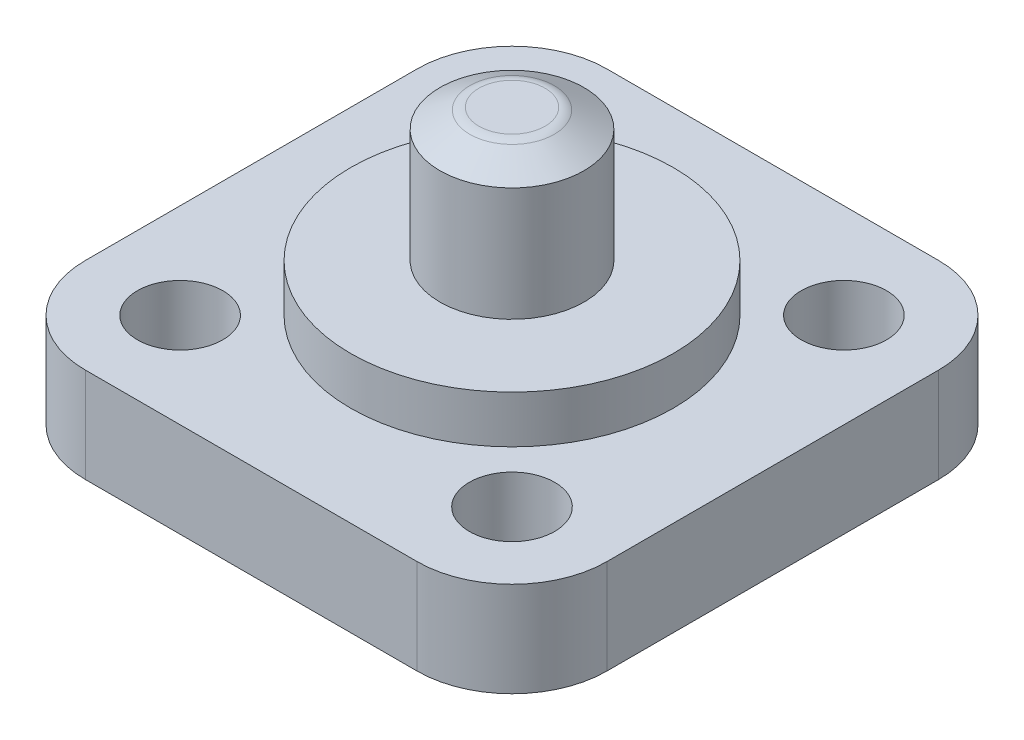
ISO-10303-21;
HEADER;
FILE_DESCRIPTION(('STEP AP214'),'2;1');
FILE_NAME('part.step','',(''),(''),'','','');
FILE_SCHEMA(('AUTOMOTIVE_DESIGN { 1 0 10303 214 1 1 1 1 }'));
ENDSEC;
DATA;
#1=APPLICATION_CONTEXT('core data for automotive mechanical design processes');
#2=APPLICATION_PROTOCOL_DEFINITION('international standard','automotive_design',2000,#1);
#3=PRODUCT_CONTEXT('',#1,'mechanical');
#4=PRODUCT('Part','Part','',(#3));
#5=PRODUCT_RELATED_PRODUCT_CATEGORY('part','',(#4));
#6=PRODUCT_DEFINITION_FORMATION('','',#4);
#7=PRODUCT_DEFINITION_CONTEXT('part definition',#1,'design');
#8=PRODUCT_DEFINITION('design','',#6,#7);
#9=PRODUCT_DEFINITION_SHAPE('','',#8);
#10=(LENGTH_UNIT() NAMED_UNIT(*) SI_UNIT(.MILLI.,.METRE.));
#11=(NAMED_UNIT(*) PLANE_ANGLE_UNIT() SI_UNIT($,.RADIAN.));
#12=(NAMED_UNIT(*) SI_UNIT($,.STERADIAN.) SOLID_ANGLE_UNIT());
#13=UNCERTAINTY_MEASURE_WITH_UNIT(LENGTH_MEASURE(1.E-05),#10,'distance_accuracy_value','');
#14=(GEOMETRIC_REPRESENTATION_CONTEXT(3) GLOBAL_UNCERTAINTY_ASSIGNED_CONTEXT((#13)) GLOBAL_UNIT_ASSIGNED_CONTEXT((#10,
#11,#12)) REPRESENTATION_CONTEXT('',''));
#15=CARTESIAN_POINT('',(0.,0.,0.));
#16=DIRECTION('',(0.,0.,1.));
#17=DIRECTION('',(1.,0.,0.));
#18=AXIS2_PLACEMENT_3D('',#15,#16,#17);
#19=CARTESIAN_POINT('',(0.,9.5,0.));
#20=DIRECTION('',(0.,-1.,0.));
#21=DIRECTION('',(0.,0.,-1.));
#22=AXIS2_PLACEMENT_3D('',#19,#20,#21);
#23=PLANE('',#22);
#24=CARTESIAN_POINT('',(0.,9.5,0.));
#25=DIRECTION('',(0.,1.,0.));
#26=DIRECTION('',(0.,0.,1.));
#27=AXIS2_PLACEMENT_3D('',#24,#25,#26);
#28=CIRCLE('',#27,3.4817479436052);
#29=CARTESIAN_POINT('',(0.,9.5,3.4817479436052));
#30=VERTEX_POINT('',#29);
#31=EDGE_CURVE('E11',#30,#30,#28,.T.);
#32=ORIENTED_EDGE('',*,*,#31,.T.);
#33=EDGE_LOOP('',(#32));
#34=FACE_BOUND('',#33,.T.);
#35=ADVANCED_FACE('F37',(#34),#23,.F.);
#36=CARTESIAN_POINT('',(0.,7.5,0.));
#37=DIRECTION('',(0.,1.,0.));
#38=DIRECTION('',(0.,0.,1.));
#39=AXIS2_PLACEMENT_3D('',#36,#37,#38);
#40=TOROIDAL_SURFACE('',#39,3.4817479436052,2.);
#41=ORIENTED_EDGE('',*,*,#31,.F.);
#42=EDGE_LOOP('',(#41));
#43=FACE_BOUND('',#42,.T.);
#44=CARTESIAN_POINT('',(0.,9.24831455224307,0.));
#45=DIRECTION('',(0.,1.,0.));
#46=DIRECTION('',(0.,0.,1.));
#47=AXIS2_PLACEMENT_3D('',#44,#45,#46);
#48=CIRCLE('',#47,4.45303380596247);
#49=CARTESIAN_POINT('',(0.,9.24831455224307,4.45303380596247));
#50=VERTEX_POINT('',#49);
#51=EDGE_CURVE('E45',#50,#50,#48,.T.);
#52=ORIENTED_EDGE('',*,*,#51,.T.);
#53=EDGE_LOOP('',(#52));
#54=FACE_BOUND('',#53,.T.);
#55=ADVANCED_FACE('F178',(#43,#54),#40,.T.);
#56=CARTESIAN_POINT('',(0.,7.5,0.));
#57=DIRECTION('',(0.,-1.,0.));
#58=DIRECTION('',(0.,0.,-1.));
#59=AXIS2_PLACEMENT_3D('',#56,#57,#58);
#60=CONICAL_SURFACE('',#59,7.6,1.06369782240256);
#61=ORIENTED_EDGE('',*,*,#51,.F.);
#62=EDGE_LOOP('',(#61));
#63=FACE_BOUND('',#62,.T.);
#64=CARTESIAN_POINT('',(0.,7.5,0.));
#65=DIRECTION('',(0.,1.,0.));
#66=DIRECTION('',(0.,0.,1.));
#67=AXIS2_PLACEMENT_3D('',#64,#65,#66);
#68=CIRCLE('',#67,7.6);
#69=CARTESIAN_POINT('',(0.,7.5,7.6));
#70=VERTEX_POINT('',#69);
#71=EDGE_CURVE('E173',#70,#70,#68,.T.);
#72=ORIENTED_EDGE('',*,*,#71,.T.);
#73=EDGE_LOOP('',(#72));
#74=FACE_BOUND('',#73,.T.);
#75=ADVANCED_FACE('F180',(#63,#74),#60,.T.);
#76=CARTESIAN_POINT('',(0.,9.5,0.));
#77=DIRECTION('',(0.,1.,0.));
#78=DIRECTION('',(0.,0.,1.));
#79=AXIS2_PLACEMENT_3D('',#76,#77,#78);
#80=CYLINDRICAL_SURFACE('',#79,7.6);
#81=ORIENTED_EDGE('',*,*,#71,.F.);
#82=EDGE_LOOP('',(#81));
#83=FACE_BOUND('',#82,.T.);
#84=CARTESIAN_POINT('',(0.,-4.5,0.));
#85=DIRECTION('',(0.,1.,0.));
#86=DIRECTION('',(0.,0.,1.));
#87=AXIS2_PLACEMENT_3D('',#84,#85,#86);
#88=CIRCLE('',#87,7.6);
#89=CARTESIAN_POINT('',(0.,-4.5,7.6));
#90=VERTEX_POINT('',#89);
#91=EDGE_CURVE('E170',#90,#90,#88,.T.);
#92=ORIENTED_EDGE('',*,*,#91,.T.);
#93=EDGE_LOOP('',(#92));
#94=FACE_BOUND('',#93,.T.);
#95=ADVANCED_FACE('F183',(#83,#94),#80,.T.);
#96=CARTESIAN_POINT('',(7.6,-4.5,0.));
#97=DIRECTION('',(0.,-1.,0.));
#98=DIRECTION('',(0.,0.,-1.));
#99=AXIS2_PLACEMENT_3D('',#96,#97,#98);
#100=PLANE('',#99);
#101=ORIENTED_EDGE('',*,*,#91,.F.);
#102=EDGE_LOOP('',(#101));
#103=FACE_BOUND('',#102,.T.);
#104=CARTESIAN_POINT('',(0.,-4.5,0.));
#105=DIRECTION('',(0.,1.,0.));
#106=DIRECTION('',(0.,0.,1.));
#107=AXIS2_PLACEMENT_3D('',#104,#105,#106);
#108=CIRCLE('',#107,17.);
#109=CARTESIAN_POINT('',(0.,-4.5,17.));
#110=VERTEX_POINT('',#109);
#111=EDGE_CURVE('E167',#110,#110,#108,.T.);
#112=ORIENTED_EDGE('',*,*,#111,.T.);
#113=EDGE_LOOP('',(#112));
#114=FACE_BOUND('',#113,.T.);
#115=ADVANCED_FACE('F189',(#103,#114),#100,.F.);
#116=CARTESIAN_POINT('',(0.,9.5,0.));
#117=DIRECTION('',(0.,1.,0.));
#118=DIRECTION('',(0.,0.,1.));
#119=AXIS2_PLACEMENT_3D('',#116,#117,#118);
#120=CYLINDRICAL_SURFACE('',#119,17.);
#121=ORIENTED_EDGE('',*,*,#111,.F.);
#122=EDGE_LOOP('',(#121));
#123=FACE_BOUND('',#122,.T.);
#124=CARTESIAN_POINT('',(0.,-9.5,0.));
#125=DIRECTION('',(0.,1.,0.));
#126=DIRECTION('',(0.,0.,1.));
#127=AXIS2_PLACEMENT_3D('',#124,#125,#126);
#128=CIRCLE('',#127,17.);
#129=CARTESIAN_POINT('',(0.,-9.5,17.));
#130=VERTEX_POINT('',#129);
#131=EDGE_CURVE('E164',#130,#130,#128,.T.);
#132=ORIENTED_EDGE('',*,*,#131,.T.);
#133=EDGE_LOOP('',(#132));
#134=FACE_BOUND('',#133,.T.);
#135=ADVANCED_FACE('F195',(#123,#134),#120,.T.);
#136=CARTESIAN_POINT('',(-17.5,-19.5,17.5));
#137=DIRECTION('',(0.,1.,0.));
#138=DIRECTION('',(0.,0.,1.));
#139=AXIS2_PLACEMENT_3D('',#136,#137,#138);
#140=CYLINDRICAL_SURFACE('',#139,10.);
#141=CARTESIAN_POINT('',(-17.5,-9.5,17.5));
#142=DIRECTION('',(0.,-1.,0.));
#143=DIRECTION('',(0.,0.,-1.));
#144=AXIS2_PLACEMENT_3D('',#141,#142,#143);
#145=CIRCLE('',#144,10.);
#146=CARTESIAN_POINT('',(-17.4999999999999,-9.5,27.5));
#147=VERTEX_POINT('',#146);
#148=CARTESIAN_POINT('',(-27.5,-9.5,17.4999999999999));
#149=VERTEX_POINT('',#148);
#150=EDGE_CURVE('E134',#147,#149,#145,.T.);
#151=ORIENTED_EDGE('',*,*,#150,.T.);
#152=DIRECTION('',(0.,1.,0.));
#153=VECTOR('',#152,1.);
#154=CARTESIAN_POINT('',(-27.5,-19.5,17.4999999999999));
#155=LINE('',#154,#153);
#156=CARTESIAN_POINT('',(-27.5,-19.5,17.4999999999999));
#157=VERTEX_POINT('',#156);
#158=EDGE_CURVE('E162',#157,#149,#155,.T.);
#159=ORIENTED_EDGE('',*,*,#158,.F.);
#160=CARTESIAN_POINT('',(-17.5,-19.5,17.5));
#161=DIRECTION('',(0.,-1.,0.));
#162=DIRECTION('',(0.,0.,-1.));
#163=AXIS2_PLACEMENT_3D('',#160,#161,#162);
#164=CIRCLE('',#163,10.);
#165=CARTESIAN_POINT('',(-17.4999999999999,-19.5,27.5));
#166=VERTEX_POINT('',#165);
#167=EDGE_CURVE('E149',#166,#157,#164,.T.);
#168=ORIENTED_EDGE('',*,*,#167,.F.);
#169=DIRECTION('',(0.,1.,0.));
#170=VECTOR('',#169,1.);
#171=CARTESIAN_POINT('',(-17.4999999999999,-19.5,27.5));
#172=LINE('',#171,#170);
#173=EDGE_CURVE('E130',#166,#147,#172,.T.);
#174=ORIENTED_EDGE('',*,*,#173,.T.);
#175=EDGE_LOOP('',(#151,#159,#168,#174));
#176=FACE_BOUND('',#175,.T.);
#177=ADVANCED_FACE('F201',(#176),#140,.T.);
#178=CARTESIAN_POINT('',(-27.5,-19.5,17.4999999999999));
#179=DIRECTION('',(1.,0.,0.));
#180=DIRECTION('',(0.,0.,-1.));
#181=AXIS2_PLACEMENT_3D('',#178,#179,#180);
#182=PLANE('',#181);
#183=DIRECTION('',(0.,0.,-1.));
#184=VECTOR('',#183,1.);
#185=CARTESIAN_POINT('',(-27.5,-9.5,17.4999999999999));
#186=LINE('',#185,#184);
#187=CARTESIAN_POINT('',(-27.5,-9.5,-17.4999999999999));
#188=VERTEX_POINT('',#187);
#189=EDGE_CURVE('E137',#149,#188,#186,.T.);
#190=ORIENTED_EDGE('',*,*,#189,.T.);
#191=DIRECTION('',(0.,1.,0.));
#192=VECTOR('',#191,1.);
#193=CARTESIAN_POINT('',(-27.5,-19.5,-17.4999999999999));
#194=LINE('',#193,#192);
#195=CARTESIAN_POINT('',(-27.5,-19.5,-17.4999999999999));
#196=VERTEX_POINT('',#195);
#197=EDGE_CURVE('E159',#196,#188,#194,.T.);
#198=ORIENTED_EDGE('',*,*,#197,.F.);
#199=DIRECTION('',(0.,0.,-1.));
#200=VECTOR('',#199,1.);
#201=CARTESIAN_POINT('',(-27.5,-19.5,17.4999999999999));
#202=LINE('',#201,#200);
#203=EDGE_CURVE('E97',#157,#196,#202,.T.);
#204=ORIENTED_EDGE('',*,*,#203,.F.);
#205=ORIENTED_EDGE('',*,*,#158,.T.);
#206=EDGE_LOOP('',(#190,#198,#204,#205));
#207=FACE_BOUND('',#206,.T.);
#208=ADVANCED_FACE('F238',(#207),#182,.F.);
#209=CARTESIAN_POINT('',(-17.5,-19.5,-17.5));
#210=DIRECTION('',(0.,1.,0.));
#211=DIRECTION('',(0.,0.,1.));
#212=AXIS2_PLACEMENT_3D('',#209,#210,#211);
#213=CYLINDRICAL_SURFACE('',#212,10.);
#214=CARTESIAN_POINT('',(-17.5,-9.5,-17.5));
#215=DIRECTION('',(0.,-1.,0.));
#216=DIRECTION('',(0.,0.,1.));
#217=AXIS2_PLACEMENT_3D('',#214,#215,#216);
#218=CIRCLE('',#217,10.);
#219=CARTESIAN_POINT('',(-17.4999999999999,-9.5,-27.5));
#220=VERTEX_POINT('',#219);
#221=EDGE_CURVE('E140',#188,#220,#218,.T.);
#222=ORIENTED_EDGE('',*,*,#221,.T.);
#223=DIRECTION('',(0.,1.,0.));
#224=VECTOR('',#223,1.);
#225=CARTESIAN_POINT('',(-17.4999999999999,-19.5,-27.5));
#226=LINE('',#225,#224);
#227=CARTESIAN_POINT('',(-17.4999999999999,-19.5,-27.5));
#228=VERTEX_POINT('',#227);
#229=EDGE_CURVE('E156',#228,#220,#226,.T.);
#230=ORIENTED_EDGE('',*,*,#229,.F.);
#231=CARTESIAN_POINT('',(-17.5,-19.5,-17.5));
#232=DIRECTION('',(0.,-1.,0.));
#233=DIRECTION('',(0.,0.,1.));
#234=AXIS2_PLACEMENT_3D('',#231,#232,#233);
#235=CIRCLE('',#234,10.);
#236=EDGE_CURVE('E452',#196,#228,#235,.T.);
#237=ORIENTED_EDGE('',*,*,#236,.F.);
#238=ORIENTED_EDGE('',*,*,#197,.T.);
#239=EDGE_LOOP('',(#222,#230,#237,#238));
#240=FACE_BOUND('',#239,.T.);
#241=ADVANCED_FACE('F241',(#240),#213,.T.);
#242=CARTESIAN_POINT('',(17.4999999999999,-19.5,-27.5));
#243=DIRECTION('',(0.,0.,1.));
#244=DIRECTION('',(1.,0.,0.));
#245=AXIS2_PLACEMENT_3D('',#242,#243,#244);
#246=PLANE('',#245);
#247=DIRECTION('',(1.,0.,0.));
#248=VECTOR('',#247,1.);
#249=CARTESIAN_POINT('',(17.4999999999999,-9.5,-27.5));
#250=LINE('',#249,#248);
#251=CARTESIAN_POINT('',(17.4999999999999,-9.5,-27.5));
#252=VERTEX_POINT('',#251);
#253=EDGE_CURVE('E142',#220,#252,#250,.T.);
#254=ORIENTED_EDGE('',*,*,#253,.T.);
#255=DIRECTION('',(0.,1.,0.));
#256=VECTOR('',#255,1.);
#257=CARTESIAN_POINT('',(17.4999999999999,-19.5,-27.5));
#258=LINE('',#257,#256);
#259=CARTESIAN_POINT('',(17.4999999999999,-19.5,-27.5));
#260=VERTEX_POINT('',#259);
#261=EDGE_CURVE('E153',#260,#252,#258,.T.);
#262=ORIENTED_EDGE('',*,*,#261,.F.);
#263=DIRECTION('',(1.,0.,0.));
#264=VECTOR('',#263,1.);
#265=CARTESIAN_POINT('',(17.4999999999999,-19.5,-27.5));
#266=LINE('',#265,#264);
#267=EDGE_CURVE('E454',#228,#260,#266,.T.);
#268=ORIENTED_EDGE('',*,*,#267,.F.);
#269=ORIENTED_EDGE('',*,*,#229,.T.);
#270=EDGE_LOOP('',(#254,#262,#268,#269));
#271=FACE_BOUND('',#270,.T.);
#272=ADVANCED_FACE('F244',(#271),#246,.F.);
#273=CARTESIAN_POINT('',(17.5,-19.5,-17.5));
#274=DIRECTION('',(0.,1.,0.));
#275=DIRECTION('',(0.,0.,1.));
#276=AXIS2_PLACEMENT_3D('',#273,#274,#275);
#277=CYLINDRICAL_SURFACE('',#276,10.);
#278=CARTESIAN_POINT('',(17.5,-9.5,-17.5));
#279=DIRECTION('',(0.,-1.,0.));
#280=DIRECTION('',(0.,0.,1.));
#281=AXIS2_PLACEMENT_3D('',#278,#279,#280);
#282=CIRCLE('',#281,10.);
#283=CARTESIAN_POINT('',(27.5,-9.5,-17.4999999999999));
#284=VERTEX_POINT('',#283);
#285=EDGE_CURVE('E144',#252,#284,#282,.T.);
#286=ORIENTED_EDGE('',*,*,#285,.T.);
#287=DIRECTION('',(0.,1.,0.));
#288=VECTOR('',#287,1.);
#289=CARTESIAN_POINT('',(27.5,-19.5,-17.4999999999999));
#290=LINE('',#289,#288);
#291=CARTESIAN_POINT('',(27.5,-19.5,-17.4999999999999));
#292=VERTEX_POINT('',#291);
#293=EDGE_CURVE('E125',#292,#284,#290,.T.);
#294=ORIENTED_EDGE('',*,*,#293,.F.);
#295=CARTESIAN_POINT('',(17.5,-19.5,-17.5));
#296=DIRECTION('',(0.,-1.,0.));
#297=DIRECTION('',(0.,0.,1.));
#298=AXIS2_PLACEMENT_3D('',#295,#296,#297);
#299=CIRCLE('',#298,10.);
#300=EDGE_CURVE('E116',#260,#292,#299,.T.);
#301=ORIENTED_EDGE('',*,*,#300,.F.);
#302=ORIENTED_EDGE('',*,*,#261,.T.);
#303=EDGE_LOOP('',(#286,#294,#301,#302));
#304=FACE_BOUND('',#303,.T.);
#305=ADVANCED_FACE('F248',(#304),#277,.T.);
#306=CARTESIAN_POINT('',(27.5,-19.5,17.4999999999999));
#307=DIRECTION('',(-1.,0.,0.));
#308=DIRECTION('',(0.,0.,1.));
#309=AXIS2_PLACEMENT_3D('',#306,#307,#308);
#310=PLANE('',#309);
#311=DIRECTION('',(0.,0.,1.));
#312=VECTOR('',#311,1.);
#313=CARTESIAN_POINT('',(27.5,-9.5,17.4999999999999));
#314=LINE('',#313,#312);
#315=CARTESIAN_POINT('',(27.5,-9.5,17.4999999999999));
#316=VERTEX_POINT('',#315);
#317=EDGE_CURVE('E124',#284,#316,#314,.T.);
#318=ORIENTED_EDGE('',*,*,#317,.T.);
#319=DIRECTION('',(0.,1.,0.));
#320=VECTOR('',#319,1.);
#321=CARTESIAN_POINT('',(27.5,-19.5,17.4999999999999));
#322=LINE('',#321,#320);
#323=CARTESIAN_POINT('',(27.5,-19.5,17.4999999999999));
#324=VERTEX_POINT('',#323);
#325=EDGE_CURVE('E121',#324,#316,#322,.T.);
#326=ORIENTED_EDGE('',*,*,#325,.F.);
#327=DIRECTION('',(0.,0.,1.));
#328=VECTOR('',#327,1.);
#329=CARTESIAN_POINT('',(27.5,-19.5,17.4999999999999));
#330=LINE('',#329,#328);
#331=EDGE_CURVE('E110',#292,#324,#330,.T.);
#332=ORIENTED_EDGE('',*,*,#331,.F.);
#333=ORIENTED_EDGE('',*,*,#293,.T.);
#334=EDGE_LOOP('',(#318,#326,#332,#333));
#335=FACE_BOUND('',#334,.T.);
#336=ADVANCED_FACE('F122',(#335),#310,.F.);
#337=CARTESIAN_POINT('',(17.5,-19.5,17.5));
#338=DIRECTION('',(0.,1.,0.));
#339=DIRECTION('',(0.,0.,1.));
#340=AXIS2_PLACEMENT_3D('',#337,#338,#339);
#341=CYLINDRICAL_SURFACE('',#340,10.);
#342=CARTESIAN_POINT('',(17.5,-9.5,17.5));
#343=DIRECTION('',(0.,-1.,0.));
#344=DIRECTION('',(0.,0.,1.));
#345=AXIS2_PLACEMENT_3D('',#342,#343,#344);
#346=CIRCLE('',#345,10.);
#347=CARTESIAN_POINT('',(17.4999999999999,-9.5,27.5));
#348=VERTEX_POINT('',#347);
#349=EDGE_CURVE('E82',#316,#348,#346,.T.);
#350=ORIENTED_EDGE('',*,*,#349,.T.);
#351=DIRECTION('',(0.,1.,0.));
#352=VECTOR('',#351,1.);
#353=CARTESIAN_POINT('',(17.4999999999999,-19.5,27.5));
#354=LINE('',#353,#352);
#355=CARTESIAN_POINT('',(17.4999999999999,-19.5,27.5));
#356=VERTEX_POINT('',#355);
#357=EDGE_CURVE('E126',#356,#348,#354,.T.);
#358=ORIENTED_EDGE('',*,*,#357,.F.);
#359=CARTESIAN_POINT('',(17.5,-19.5,17.5));
#360=DIRECTION('',(0.,-1.,0.));
#361=DIRECTION('',(0.,0.,1.));
#362=AXIS2_PLACEMENT_3D('',#359,#360,#361);
#363=CIRCLE('',#362,10.);
#364=EDGE_CURVE('E114',#324,#356,#363,.T.);
#365=ORIENTED_EDGE('',*,*,#364,.F.);
#366=ORIENTED_EDGE('',*,*,#325,.T.);
#367=EDGE_LOOP('',(#350,#358,#365,#366));
#368=FACE_BOUND('',#367,.T.);
#369=ADVANCED_FACE('F128',(#368),#341,.T.);
#370=CARTESIAN_POINT('',(17.4999999999999,-19.5,27.5));
#371=DIRECTION('',(0.,0.,-1.));
#372=DIRECTION('',(-1.,0.,0.));
#373=AXIS2_PLACEMENT_3D('',#370,#371,#372);
#374=PLANE('',#373);
#375=DIRECTION('',(-1.,0.,0.));
#376=VECTOR('',#375,1.);
#377=CARTESIAN_POINT('',(17.4999999999999,-9.5,27.5));
#378=LINE('',#377,#376);
#379=EDGE_CURVE('E88',#348,#147,#378,.T.);
#380=ORIENTED_EDGE('',*,*,#379,.T.);
#381=ORIENTED_EDGE('',*,*,#173,.F.);
#382=DIRECTION('',(-1.,0.,0.));
#383=VECTOR('',#382,1.);
#384=CARTESIAN_POINT('',(17.4999999999999,-19.5,27.5));
#385=LINE('',#384,#383);
#386=EDGE_CURVE('E53',#356,#166,#385,.T.);
#387=ORIENTED_EDGE('',*,*,#386,.F.);
#388=ORIENTED_EDGE('',*,*,#357,.T.);
#389=EDGE_LOOP('',(#380,#381,#387,#388));
#390=FACE_BOUND('',#389,.T.);
#391=ADVANCED_FACE('F216',(#390),#374,.F.);
#392=CARTESIAN_POINT('',(-17.5,-19.5,17.5));
#393=DIRECTION('',(0.,-1.,0.));
#394=DIRECTION('',(0.,0.,-1.));
#395=AXIS2_PLACEMENT_3D('',#392,#393,#394);
#396=PLANE('',#395);
#397=CARTESIAN_POINT('',(17.5,-19.5,17.5));
#398=DIRECTION('',(0.,1.,0.));
#399=DIRECTION('',(0.,0.,-1.));
#400=AXIS2_PLACEMENT_3D('',#397,#398,#399);
#401=CIRCLE('',#400,4.5);
#402=CARTESIAN_POINT('',(17.5,-19.5,13.));
#403=VERTEX_POINT('',#402);
#404=EDGE_CURVE('E426',#403,#403,#401,.T.);
#405=ORIENTED_EDGE('',*,*,#404,.T.);
#406=EDGE_LOOP('',(#405));
#407=FACE_BOUND('',#406,.T.);
#408=CARTESIAN_POINT('',(-17.5,-19.5,17.5));
#409=DIRECTION('',(0.,-1.,0.));
#410=DIRECTION('',(0.,0.,-1.));
#411=AXIS2_PLACEMENT_3D('',#408,#409,#410);
#412=CIRCLE('',#411,4.5);
#413=CARTESIAN_POINT('',(-17.5,-19.5,13.));
#414=VERTEX_POINT('',#413);
#415=EDGE_CURVE('E434',#414,#414,#412,.T.);
#416=ORIENTED_EDGE('',*,*,#415,.F.);
#417=EDGE_LOOP('',(#416));
#418=FACE_BOUND('',#417,.T.);
#419=CARTESIAN_POINT('',(17.5,-19.5,-17.5));
#420=DIRECTION('',(0.,-1.,0.));
#421=DIRECTION('',(0.,0.,1.));
#422=AXIS2_PLACEMENT_3D('',#419,#420,#421);
#423=CIRCLE('',#422,4.5);
#424=CARTESIAN_POINT('',(17.5,-19.5,-13.));
#425=VERTEX_POINT('',#424);
#426=EDGE_CURVE('E440',#425,#425,#423,.T.);
#427=ORIENTED_EDGE('',*,*,#426,.F.);
#428=EDGE_LOOP('',(#427));
#429=FACE_BOUND('',#428,.T.);
#430=CARTESIAN_POINT('',(-17.5,-19.5,-17.5));
#431=DIRECTION('',(0.,1.,0.));
#432=DIRECTION('',(0.,0.,1.));
#433=AXIS2_PLACEMENT_3D('',#430,#431,#432);
#434=CIRCLE('',#433,4.5);
#435=CARTESIAN_POINT('',(-17.5,-19.5,-13.));
#436=VERTEX_POINT('',#435);
#437=EDGE_CURVE('E138',#436,#436,#434,.T.);
#438=ORIENTED_EDGE('',*,*,#437,.T.);
#439=EDGE_LOOP('',(#438));
#440=FACE_BOUND('',#439,.T.);
#441=ORIENTED_EDGE('',*,*,#167,.T.);
#442=ORIENTED_EDGE('',*,*,#203,.T.);
#443=ORIENTED_EDGE('',*,*,#236,.T.);
#444=ORIENTED_EDGE('',*,*,#267,.T.);
#445=ORIENTED_EDGE('',*,*,#300,.T.);
#446=ORIENTED_EDGE('',*,*,#331,.T.);
#447=ORIENTED_EDGE('',*,*,#364,.T.);
#448=ORIENTED_EDGE('',*,*,#386,.T.);
#449=EDGE_LOOP('',(#441,#442,#443,#444,#445,#446,#447,#448));
#450=FACE_BOUND('',#449,.T.);
#451=ADVANCED_FACE('F112',(#407,#418,#429,#440,#450),#396,.T.);
#452=CARTESIAN_POINT('',(-17.5,-9.5,17.5));
#453=DIRECTION('',(0.,-1.,0.));
#454=DIRECTION('',(0.,0.,-1.));
#455=AXIS2_PLACEMENT_3D('',#452,#453,#454);
#456=PLANE('',#455);
#457=CARTESIAN_POINT('',(17.5,-9.5,17.5));
#458=DIRECTION('',(0.,1.,0.));
#459=DIRECTION('',(0.,0.,-1.));
#460=AXIS2_PLACEMENT_3D('',#457,#458,#459);
#461=CIRCLE('',#460,4.5);
#462=CARTESIAN_POINT('',(17.5,-9.5,13.));
#463=VERTEX_POINT('',#462);
#464=EDGE_CURVE('E429',#463,#463,#461,.T.);
#465=ORIENTED_EDGE('',*,*,#464,.F.);
#466=EDGE_LOOP('',(#465));
#467=FACE_BOUND('',#466,.T.);
#468=CARTESIAN_POINT('',(-17.5,-9.5,17.5));
#469=DIRECTION('',(0.,-1.,0.));
#470=DIRECTION('',(0.,0.,-1.));
#471=AXIS2_PLACEMENT_3D('',#468,#469,#470);
#472=CIRCLE('',#471,4.5);
#473=CARTESIAN_POINT('',(-17.5,-9.5,13.));
#474=VERTEX_POINT('',#473);
#475=EDGE_CURVE('E431',#474,#474,#472,.T.);
#476=ORIENTED_EDGE('',*,*,#475,.T.);
#477=EDGE_LOOP('',(#476));
#478=FACE_BOUND('',#477,.T.);
#479=CARTESIAN_POINT('',(17.5,-9.5,-17.5));
#480=DIRECTION('',(0.,-1.,0.));
#481=DIRECTION('',(0.,0.,1.));
#482=AXIS2_PLACEMENT_3D('',#479,#480,#481);
#483=CIRCLE('',#482,4.5);
#484=CARTESIAN_POINT('',(17.5,-9.5,-13.));
#485=VERTEX_POINT('',#484);
#486=EDGE_CURVE('E437',#485,#485,#483,.T.);
#487=ORIENTED_EDGE('',*,*,#486,.T.);
#488=EDGE_LOOP('',(#487));
#489=FACE_BOUND('',#488,.T.);
#490=CARTESIAN_POINT('',(-17.5,-9.5,-17.5));
#491=DIRECTION('',(0.,1.,0.));
#492=DIRECTION('',(0.,0.,1.));
#493=AXIS2_PLACEMENT_3D('',#490,#491,#492);
#494=CIRCLE('',#493,4.5);
#495=CARTESIAN_POINT('',(-17.5,-9.5,-13.));
#496=VERTEX_POINT('',#495);
#497=EDGE_CURVE('E443',#496,#496,#494,.T.);
#498=ORIENTED_EDGE('',*,*,#497,.F.);
#499=EDGE_LOOP('',(#498));
#500=FACE_BOUND('',#499,.T.);
#501=ORIENTED_EDGE('',*,*,#131,.F.);
#502=EDGE_LOOP('',(#501));
#503=FACE_BOUND('',#502,.T.);
#504=ORIENTED_EDGE('',*,*,#150,.F.);
#505=ORIENTED_EDGE('',*,*,#379,.F.);
#506=ORIENTED_EDGE('',*,*,#349,.F.);
#507=ORIENTED_EDGE('',*,*,#317,.F.);
#508=ORIENTED_EDGE('',*,*,#285,.F.);
#509=ORIENTED_EDGE('',*,*,#253,.F.);
#510=ORIENTED_EDGE('',*,*,#221,.F.);
#511=ORIENTED_EDGE('',*,*,#189,.F.);
#512=EDGE_LOOP('',(#504,#505,#506,#507,#508,#509,#510,#511));
#513=FACE_BOUND('',#512,.T.);
#514=ADVANCED_FACE('F205',(#467,#478,#489,#500,#503,#513),#456,.F.);
#515=CARTESIAN_POINT('',(-17.5,-19.5,-17.5));
#516=DIRECTION('',(0.,1.,0.));
#517=DIRECTION('',(0.,0.,1.));
#518=AXIS2_PLACEMENT_3D('',#515,#516,#517);
#519=CYLINDRICAL_SURFACE('',#518,4.5);
#520=ORIENTED_EDGE('',*,*,#437,.F.);
#521=EDGE_LOOP('',(#520));
#522=FACE_BOUND('',#521,.T.);
#523=ORIENTED_EDGE('',*,*,#497,.T.);
#524=EDGE_LOOP('',(#523));
#525=FACE_BOUND('',#524,.T.);
#526=ADVANCED_FACE('F208',(#522,#525),#519,.F.);
#527=CARTESIAN_POINT('',(17.5,-19.5,-17.5));
#528=DIRECTION('',(0.,1.,0.));
#529=DIRECTION('',(0.,0.,1.));
#530=AXIS2_PLACEMENT_3D('',#527,#528,#529);
#531=CYLINDRICAL_SURFACE('',#530,4.5);
#532=ORIENTED_EDGE('',*,*,#426,.T.);
#533=EDGE_LOOP('',(#532));
#534=FACE_BOUND('',#533,.T.);
#535=ORIENTED_EDGE('',*,*,#486,.F.);
#536=EDGE_LOOP('',(#535));
#537=FACE_BOUND('',#536,.T.);
#538=ADVANCED_FACE('F278',(#534,#537),#531,.F.);
#539=CARTESIAN_POINT('',(-17.5,-19.5,17.5));
#540=DIRECTION('',(0.,1.,0.));
#541=DIRECTION('',(0.,0.,1.));
#542=AXIS2_PLACEMENT_3D('',#539,#540,#541);
#543=CYLINDRICAL_SURFACE('',#542,4.5);
#544=ORIENTED_EDGE('',*,*,#415,.T.);
#545=EDGE_LOOP('',(#544));
#546=FACE_BOUND('',#545,.T.);
#547=ORIENTED_EDGE('',*,*,#475,.F.);
#548=EDGE_LOOP('',(#547));
#549=FACE_BOUND('',#548,.T.);
#550=ADVANCED_FACE('F302',(#546,#549),#543,.F.);
#551=CARTESIAN_POINT('',(17.5,-19.5,17.5));
#552=DIRECTION('',(0.,1.,0.));
#553=DIRECTION('',(0.,0.,1.));
#554=AXIS2_PLACEMENT_3D('',#551,#552,#553);
#555=CYLINDRICAL_SURFACE('',#554,4.5);
#556=ORIENTED_EDGE('',*,*,#404,.F.);
#557=EDGE_LOOP('',(#556));
#558=FACE_BOUND('',#557,.T.);
#559=ORIENTED_EDGE('',*,*,#464,.T.);
#560=EDGE_LOOP('',(#559));
#561=FACE_BOUND('',#560,.T.);
#562=ADVANCED_FACE('F313',(#558,#561),#555,.F.);
#563=CLOSED_SHELL('',(#35,#55,#75,#95,#115,#135,#177,#208,#241,#272,#305,#336,#369,#391,#451,
#514,#526,#538,#550,#562));
#564=MANIFOLD_SOLID_BREP('B2',#563);
#565=ADVANCED_BREP_SHAPE_REPRESENTATION('',(#18,#564),#14);
#566=SHAPE_DEFINITION_REPRESENTATION(#9,#565);
ENDSEC;
END-ISO-10303-21;
